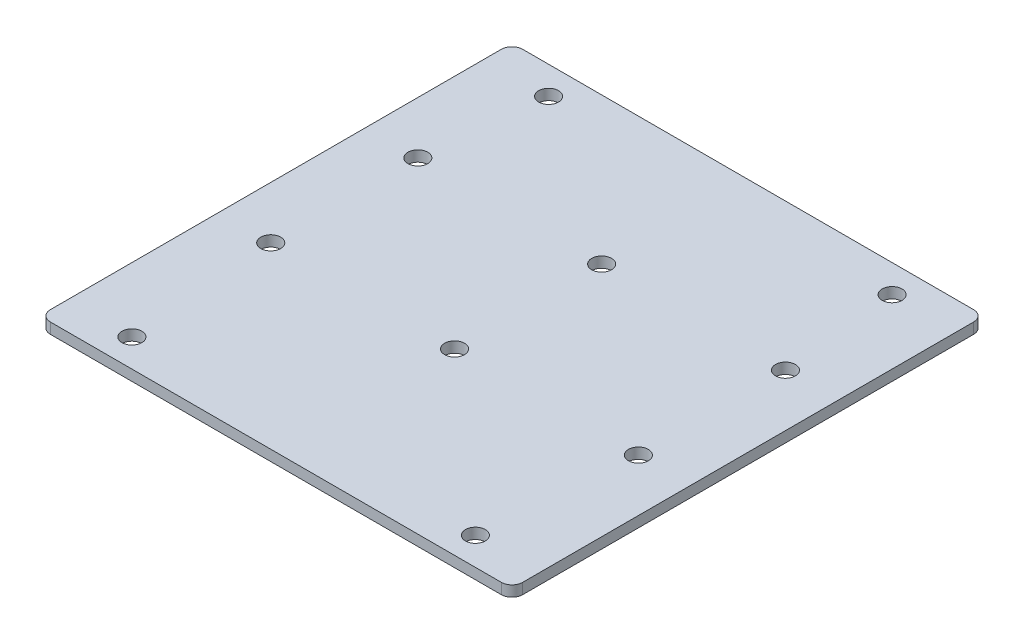
ISO-10303-21;
HEADER;
FILE_DESCRIPTION(('STEP AP214'),'2;1');
FILE_NAME('part.step','',(''),(''),'','','');
FILE_SCHEMA(('AUTOMOTIVE_DESIGN { 1 0 10303 214 1 1 1 1 }'));
ENDSEC;
DATA;
#1=APPLICATION_CONTEXT('core data for automotive mechanical design processes');
#2=APPLICATION_PROTOCOL_DEFINITION('international standard','automotive_design',2000,#1);
#3=PRODUCT_CONTEXT('',#1,'mechanical');
#4=PRODUCT('Part','Part','',(#3));
#5=PRODUCT_RELATED_PRODUCT_CATEGORY('part','',(#4));
#6=PRODUCT_DEFINITION_FORMATION('','',#4);
#7=PRODUCT_DEFINITION_CONTEXT('part definition',#1,'design');
#8=PRODUCT_DEFINITION('design','',#6,#7);
#9=PRODUCT_DEFINITION_SHAPE('','',#8);
#10=(LENGTH_UNIT() NAMED_UNIT(*) SI_UNIT(.MILLI.,.METRE.));
#11=(NAMED_UNIT(*) PLANE_ANGLE_UNIT() SI_UNIT($,.RADIAN.));
#12=(NAMED_UNIT(*) SI_UNIT($,.STERADIAN.) SOLID_ANGLE_UNIT());
#13=UNCERTAINTY_MEASURE_WITH_UNIT(LENGTH_MEASURE(1.E-05),#10,'distance_accuracy_value','');
#14=(GEOMETRIC_REPRESENTATION_CONTEXT(3) GLOBAL_UNCERTAINTY_ASSIGNED_CONTEXT((#13)) GLOBAL_UNIT_ASSIGNED_CONTEXT((#10,
#11,#12)) REPRESENTATION_CONTEXT('',''));
#15=CARTESIAN_POINT('',(0.,0.,0.));
#16=DIRECTION('',(0.,0.,1.));
#17=DIRECTION('',(1.,0.,0.));
#18=AXIS2_PLACEMENT_3D('',#15,#16,#17);
#19=CARTESIAN_POINT('',(-44.,2.,44.));
#20=DIRECTION('',(1.,0.,0.));
#21=DIRECTION('',(0.,0.,-1.));
#22=AXIS2_PLACEMENT_3D('',#19,#20,#21);
#23=PLANE('',#22);
#24=DIRECTION('',(0.,0.,1.));
#25=VECTOR('',#24,1.);
#26=CARTESIAN_POINT('',(-44.,2.,44.));
#27=LINE('',#26,#25);
#28=CARTESIAN_POINT('',(-44.,2.,-42.));
#29=VERTEX_POINT('',#28);
#30=CARTESIAN_POINT('',(-44.,2.,42.));
#31=VERTEX_POINT('',#30);
#32=EDGE_CURVE('E131',#29,#31,#27,.T.);
#33=ORIENTED_EDGE('',*,*,#32,.F.);
#34=DIRECTION('',(0.,-1.,0.));
#35=VECTOR('',#34,1.);
#36=CARTESIAN_POINT('',(-44.,2.,-42.));
#37=LINE('',#36,#35);
#38=CARTESIAN_POINT('',(-44.,0.,-42.));
#39=VERTEX_POINT('',#38);
#40=EDGE_CURVE('E115',#29,#39,#37,.T.);
#41=ORIENTED_EDGE('',*,*,#40,.T.);
#42=DIRECTION('',(0.,0.,1.));
#43=VECTOR('',#42,1.);
#44=CARTESIAN_POINT('',(-44.,0.,44.));
#45=LINE('',#44,#43);
#46=CARTESIAN_POINT('',(-44.,0.,42.));
#47=VERTEX_POINT('',#46);
#48=EDGE_CURVE('E128',#39,#47,#45,.T.);
#49=ORIENTED_EDGE('',*,*,#48,.T.);
#50=DIRECTION('',(0.,-1.,0.));
#51=VECTOR('',#50,1.);
#52=CARTESIAN_POINT('',(-44.,2.,42.));
#53=LINE('',#52,#51);
#54=EDGE_CURVE('E134',#47,#31,#53,.F.);
#55=ORIENTED_EDGE('',*,*,#54,.T.);
#56=EDGE_LOOP('',(#33,#41,#49,#55));
#57=FACE_BOUND('',#56,.T.);
#58=ADVANCED_FACE('F43',(#57),#23,.F.);
#59=CARTESIAN_POINT('',(44.,2.,44.));
#60=DIRECTION('',(0.,0.,-1.));
#61=DIRECTION('',(-1.,0.,0.));
#62=AXIS2_PLACEMENT_3D('',#59,#60,#61);
#63=PLANE('',#62);
#64=DIRECTION('',(1.,0.,0.));
#65=VECTOR('',#64,1.);
#66=CARTESIAN_POINT('',(44.,2.,44.));
#67=LINE('',#66,#65);
#68=CARTESIAN_POINT('',(-42.,2.,44.));
#69=VERTEX_POINT('',#68);
#70=CARTESIAN_POINT('',(42.,2.,44.));
#71=VERTEX_POINT('',#70);
#72=EDGE_CURVE('E194',#69,#71,#67,.T.);
#73=ORIENTED_EDGE('',*,*,#72,.F.);
#74=DIRECTION('',(0.,-1.,0.));
#75=VECTOR('',#74,1.);
#76=CARTESIAN_POINT('',(-42.,2.,44.));
#77=LINE('',#76,#75);
#78=CARTESIAN_POINT('',(-42.,0.,44.));
#79=VERTEX_POINT('',#78);
#80=EDGE_CURVE('E11',#69,#79,#77,.T.);
#81=ORIENTED_EDGE('',*,*,#80,.T.);
#82=DIRECTION('',(1.,0.,0.));
#83=VECTOR('',#82,1.);
#84=CARTESIAN_POINT('',(44.,0.,44.));
#85=LINE('',#84,#83);
#86=CARTESIAN_POINT('',(42.,0.,44.));
#87=VERTEX_POINT('',#86);
#88=EDGE_CURVE('E140',#79,#87,#85,.T.);
#89=ORIENTED_EDGE('',*,*,#88,.T.);
#90=DIRECTION('',(0.,-1.,0.));
#91=VECTOR('',#90,1.);
#92=CARTESIAN_POINT('',(42.,2.,44.));
#93=LINE('',#92,#91);
#94=EDGE_CURVE('E52',#87,#71,#93,.F.);
#95=ORIENTED_EDGE('',*,*,#94,.T.);
#96=EDGE_LOOP('',(#73,#81,#89,#95));
#97=FACE_BOUND('',#96,.T.);
#98=ADVANCED_FACE('F193',(#97),#63,.F.);
#99=CARTESIAN_POINT('',(44.,2.,44.));
#100=DIRECTION('',(-1.,0.,0.));
#101=DIRECTION('',(0.,0.,1.));
#102=AXIS2_PLACEMENT_3D('',#99,#100,#101);
#103=PLANE('',#102);
#104=DIRECTION('',(0.,0.,-1.));
#105=VECTOR('',#104,1.);
#106=CARTESIAN_POINT('',(44.,0.,44.));
#107=LINE('',#106,#105);
#108=CARTESIAN_POINT('',(44.,0.,42.));
#109=VERTEX_POINT('',#108);
#110=CARTESIAN_POINT('',(44.,0.,-42.));
#111=VERTEX_POINT('',#110);
#112=EDGE_CURVE('E146',#109,#111,#107,.T.);
#113=ORIENTED_EDGE('',*,*,#112,.T.);
#114=DIRECTION('',(0.,-1.,0.));
#115=VECTOR('',#114,1.);
#116=CARTESIAN_POINT('',(44.,2.,-42.));
#117=LINE('',#116,#115);
#118=CARTESIAN_POINT('',(44.,2.,-42.));
#119=VERTEX_POINT('',#118);
#120=EDGE_CURVE('E59',#111,#119,#117,.F.);
#121=ORIENTED_EDGE('',*,*,#120,.T.);
#122=DIRECTION('',(0.,0.,-1.));
#123=VECTOR('',#122,1.);
#124=CARTESIAN_POINT('',(44.,2.,44.));
#125=LINE('',#124,#123);
#126=CARTESIAN_POINT('',(44.,2.,42.));
#127=VERTEX_POINT('',#126);
#128=EDGE_CURVE('E201',#127,#119,#125,.T.);
#129=ORIENTED_EDGE('',*,*,#128,.F.);
#130=DIRECTION('',(0.,-1.,0.));
#131=VECTOR('',#130,1.);
#132=CARTESIAN_POINT('',(44.,2.,42.));
#133=LINE('',#132,#131);
#134=EDGE_CURVE('E184',#127,#109,#133,.T.);
#135=ORIENTED_EDGE('',*,*,#134,.T.);
#136=EDGE_LOOP('',(#113,#121,#129,#135));
#137=FACE_BOUND('',#136,.T.);
#138=ADVANCED_FACE('F205',(#137),#103,.F.);
#139=CARTESIAN_POINT('',(44.,2.,-44.));
#140=DIRECTION('',(0.,0.,1.));
#141=DIRECTION('',(1.,0.,0.));
#142=AXIS2_PLACEMENT_3D('',#139,#140,#141);
#143=PLANE('',#142);
#144=DIRECTION('',(-1.,0.,0.));
#145=VECTOR('',#144,1.);
#146=CARTESIAN_POINT('',(44.,0.,-44.));
#147=LINE('',#146,#145);
#148=CARTESIAN_POINT('',(42.,0.,-44.));
#149=VERTEX_POINT('',#148);
#150=CARTESIAN_POINT('',(-42.,0.,-44.));
#151=VERTEX_POINT('',#150);
#152=EDGE_CURVE('E157',#149,#151,#147,.T.);
#153=ORIENTED_EDGE('',*,*,#152,.T.);
#154=DIRECTION('',(0.,-1.,0.));
#155=VECTOR('',#154,1.);
#156=CARTESIAN_POINT('',(-42.,2.,-44.));
#157=LINE('',#156,#155);
#158=CARTESIAN_POINT('',(-42.,2.,-44.));
#159=VERTEX_POINT('',#158);
#160=EDGE_CURVE('E116',#151,#159,#157,.F.);
#161=ORIENTED_EDGE('',*,*,#160,.T.);
#162=DIRECTION('',(-1.,0.,0.));
#163=VECTOR('',#162,1.);
#164=CARTESIAN_POINT('',(44.,2.,-44.));
#165=LINE('',#164,#163);
#166=CARTESIAN_POINT('',(42.,2.,-44.));
#167=VERTEX_POINT('',#166);
#168=EDGE_CURVE('E152',#167,#159,#165,.T.);
#169=ORIENTED_EDGE('',*,*,#168,.F.);
#170=DIRECTION('',(0.,-1.,0.));
#171=VECTOR('',#170,1.);
#172=CARTESIAN_POINT('',(42.,2.,-44.));
#173=LINE('',#172,#171);
#174=EDGE_CURVE('E122',#167,#149,#173,.T.);
#175=ORIENTED_EDGE('',*,*,#174,.T.);
#176=EDGE_LOOP('',(#153,#161,#169,#175));
#177=FACE_BOUND('',#176,.T.);
#178=ADVANCED_FACE('F212',(#177),#143,.F.);
#179=CARTESIAN_POINT('',(0.,2.,0.));
#180=DIRECTION('',(0.,1.,0.));
#181=DIRECTION('',(0.,0.,1.));
#182=AXIS2_PLACEMENT_3D('',#179,#180,#181);
#183=PLANE('',#182);
#184=CARTESIAN_POINT('',(-34.2500000000001,2.,-16.7));
#185=DIRECTION('',(0.,1.,0.));
#186=DIRECTION('',(0.,0.,1.));
#187=AXIS2_PLACEMENT_3D('',#184,#185,#186);
#188=CIRCLE('',#187,1.85);
#189=CARTESIAN_POINT('',(-34.2500000000001,2.,-14.85));
#190=VERTEX_POINT('',#189);
#191=EDGE_CURVE('E239',#190,#190,#188,.T.);
#192=ORIENTED_EDGE('',*,*,#191,.F.);
#193=EDGE_LOOP('',(#192));
#194=FACE_BOUND('',#193,.T.);
#195=CARTESIAN_POINT('',(0.,2.,-16.7));
#196=DIRECTION('',(0.,1.,0.));
#197=DIRECTION('',(0.,0.,1.));
#198=AXIS2_PLACEMENT_3D('',#195,#196,#197);
#199=CIRCLE('',#198,1.85);
#200=CARTESIAN_POINT('',(0.,2.,-14.85));
#201=VERTEX_POINT('',#200);
#202=EDGE_CURVE('E249',#201,#201,#199,.T.);
#203=ORIENTED_EDGE('',*,*,#202,.F.);
#204=EDGE_LOOP('',(#203));
#205=FACE_BOUND('',#204,.T.);
#206=CARTESIAN_POINT('',(34.2499999999998,2.,-16.7));
#207=DIRECTION('',(0.,1.,0.));
#208=DIRECTION('',(0.,0.,1.));
#209=AXIS2_PLACEMENT_3D('',#206,#207,#208);
#210=CIRCLE('',#209,1.85);
#211=CARTESIAN_POINT('',(34.2499999999998,2.,-14.85));
#212=VERTEX_POINT('',#211);
#213=EDGE_CURVE('E253',#212,#212,#210,.T.);
#214=ORIENTED_EDGE('',*,*,#213,.F.);
#215=EDGE_LOOP('',(#214));
#216=FACE_BOUND('',#215,.T.);
#217=CARTESIAN_POINT('',(34.2499999999999,2.,10.7));
#218=DIRECTION('',(0.,1.,0.));
#219=DIRECTION('',(0.,0.,1.));
#220=AXIS2_PLACEMENT_3D('',#217,#218,#219);
#221=CIRCLE('',#220,1.85);
#222=CARTESIAN_POINT('',(34.2499999999999,2.,12.55));
#223=VERTEX_POINT('',#222);
#224=EDGE_CURVE('E257',#223,#223,#221,.T.);
#225=ORIENTED_EDGE('',*,*,#224,.F.);
#226=EDGE_LOOP('',(#225));
#227=FACE_BOUND('',#226,.T.);
#228=CARTESIAN_POINT('',(-1.01827385961168E-13,2.,10.7));
#229=DIRECTION('',(0.,1.,0.));
#230=DIRECTION('',(0.,0.,1.));
#231=AXIS2_PLACEMENT_3D('',#228,#229,#230);
#232=CIRCLE('',#231,1.85);
#233=CARTESIAN_POINT('',(-1.01827385961168E-13,2.,12.55));
#234=VERTEX_POINT('',#233);
#235=EDGE_CURVE('E261',#234,#234,#232,.T.);
#236=ORIENTED_EDGE('',*,*,#235,.F.);
#237=EDGE_LOOP('',(#236));
#238=FACE_BOUND('',#237,.T.);
#239=CARTESIAN_POINT('',(-34.2500000000001,2.,10.7));
#240=DIRECTION('',(0.,1.,0.));
#241=DIRECTION('',(0.,0.,1.));
#242=AXIS2_PLACEMENT_3D('',#239,#240,#241);
#243=CIRCLE('',#242,1.85);
#244=CARTESIAN_POINT('',(-34.2500000000001,2.,12.55));
#245=VERTEX_POINT('',#244);
#246=EDGE_CURVE('E265',#245,#245,#243,.T.);
#247=ORIENTED_EDGE('',*,*,#246,.F.);
#248=EDGE_LOOP('',(#247));
#249=FACE_BOUND('',#248,.T.);
#250=CARTESIAN_POINT('',(-32.,2.,-38.82));
#251=DIRECTION('',(0.,1.,0.));
#252=DIRECTION('',(0.,0.,1.));
#253=AXIS2_PLACEMENT_3D('',#250,#251,#252);
#254=CIRCLE('',#253,1.85);
#255=CARTESIAN_POINT('',(-32.,2.,-36.97));
#256=VERTEX_POINT('',#255);
#257=EDGE_CURVE('E141',#256,#256,#254,.T.);
#258=ORIENTED_EDGE('',*,*,#257,.F.);
#259=EDGE_LOOP('',(#258));
#260=FACE_BOUND('',#259,.T.);
#261=CARTESIAN_POINT('',(32.,2.,-38.82));
#262=DIRECTION('',(0.,1.,0.));
#263=DIRECTION('',(0.,0.,1.));
#264=AXIS2_PLACEMENT_3D('',#261,#262,#263);
#265=CIRCLE('',#264,1.85);
#266=CARTESIAN_POINT('',(32.,2.,-36.97));
#267=VERTEX_POINT('',#266);
#268=EDGE_CURVE('E149',#267,#267,#265,.T.);
#269=ORIENTED_EDGE('',*,*,#268,.F.);
#270=EDGE_LOOP('',(#269));
#271=FACE_BOUND('',#270,.T.);
#272=CARTESIAN_POINT('',(31.9999999999999,2.,38.82));
#273=DIRECTION('',(0.,1.,0.));
#274=DIRECTION('',(0.,0.,1.));
#275=AXIS2_PLACEMENT_3D('',#272,#273,#274);
#276=CIRCLE('',#275,1.85);
#277=CARTESIAN_POINT('',(31.9999999999999,2.,40.67));
#278=VERTEX_POINT('',#277);
#279=EDGE_CURVE('E221',#278,#278,#276,.T.);
#280=ORIENTED_EDGE('',*,*,#279,.F.);
#281=EDGE_LOOP('',(#280));
#282=FACE_BOUND('',#281,.T.);
#283=CARTESIAN_POINT('',(-32.0000000000001,2.,38.82));
#284=DIRECTION('',(0.,1.,0.));
#285=DIRECTION('',(0.,0.,1.));
#286=AXIS2_PLACEMENT_3D('',#283,#284,#285);
#287=CIRCLE('',#286,1.85);
#288=CARTESIAN_POINT('',(-32.0000000000001,2.,40.67));
#289=VERTEX_POINT('',#288);
#290=EDGE_CURVE('E225',#289,#289,#287,.T.);
#291=ORIENTED_EDGE('',*,*,#290,.F.);
#292=EDGE_LOOP('',(#291));
#293=FACE_BOUND('',#292,.T.);
#294=ORIENTED_EDGE('',*,*,#168,.T.);
#295=CARTESIAN_POINT('',(-42.,2.,-42.));
#296=DIRECTION('',(0.,1.,0.));
#297=DIRECTION('',(0.,0.,1.));
#298=AXIS2_PLACEMENT_3D('',#295,#296,#297);
#299=CIRCLE('',#298,2.);
#300=EDGE_CURVE('E181',#159,#29,#299,.T.);
#301=ORIENTED_EDGE('',*,*,#300,.T.);
#302=ORIENTED_EDGE('',*,*,#32,.T.);
#303=CARTESIAN_POINT('',(-42.,2.,42.));
#304=DIRECTION('',(0.,1.,0.));
#305=DIRECTION('',(0.,0.,1.));
#306=AXIS2_PLACEMENT_3D('',#303,#304,#305);
#307=CIRCLE('',#306,2.);
#308=EDGE_CURVE('E175',#31,#69,#307,.T.);
#309=ORIENTED_EDGE('',*,*,#308,.T.);
#310=ORIENTED_EDGE('',*,*,#72,.T.);
#311=CARTESIAN_POINT('',(42.,2.,42.));
#312=DIRECTION('',(0.,1.,0.));
#313=DIRECTION('',(0.,0.,1.));
#314=AXIS2_PLACEMENT_3D('',#311,#312,#313);
#315=CIRCLE('',#314,2.);
#316=EDGE_CURVE('E66',#71,#127,#315,.T.);
#317=ORIENTED_EDGE('',*,*,#316,.T.);
#318=ORIENTED_EDGE('',*,*,#128,.T.);
#319=CARTESIAN_POINT('',(42.,2.,-42.));
#320=DIRECTION('',(0.,1.,0.));
#321=DIRECTION('',(0.,0.,1.));
#322=AXIS2_PLACEMENT_3D('',#319,#320,#321);
#323=CIRCLE('',#322,2.);
#324=EDGE_CURVE('E178',#119,#167,#323,.T.);
#325=ORIENTED_EDGE('',*,*,#324,.T.);
#326=EDGE_LOOP('',(#294,#301,#302,#309,#310,#317,#318,#325));
#327=FACE_BOUND('',#326,.T.);
#328=ADVANCED_FACE('F198',(#194,#205,#216,#227,#238,#249,#260,#271,#282,#293,#327),#183,.T.);
#329=CARTESIAN_POINT('',(0.,0.,0.));
#330=DIRECTION('',(0.,1.,0.));
#331=DIRECTION('',(0.,0.,1.));
#332=AXIS2_PLACEMENT_3D('',#329,#330,#331);
#333=PLANE('',#332);
#334=CARTESIAN_POINT('',(-34.2500000000001,0.,-16.7));
#335=DIRECTION('',(0.,-1.,0.));
#336=DIRECTION('',(0.,0.,-1.));
#337=AXIS2_PLACEMENT_3D('',#334,#335,#336);
#338=CIRCLE('',#337,1.85);
#339=CARTESIAN_POINT('',(-34.2500000000001,0.,-18.55));
#340=VERTEX_POINT('',#339);
#341=EDGE_CURVE('E274',#340,#340,#338,.T.);
#342=ORIENTED_EDGE('',*,*,#341,.F.);
#343=EDGE_LOOP('',(#342));
#344=FACE_BOUND('',#343,.T.);
#345=CARTESIAN_POINT('',(0.,0.,-16.7));
#346=DIRECTION('',(0.,-1.,0.));
#347=DIRECTION('',(0.,0.,-1.));
#348=AXIS2_PLACEMENT_3D('',#345,#346,#347);
#349=CIRCLE('',#348,1.85);
#350=CARTESIAN_POINT('',(0.,0.,-18.55));
#351=VERTEX_POINT('',#350);
#352=EDGE_CURVE('E278',#351,#351,#349,.T.);
#353=ORIENTED_EDGE('',*,*,#352,.F.);
#354=EDGE_LOOP('',(#353));
#355=FACE_BOUND('',#354,.T.);
#356=CARTESIAN_POINT('',(34.2499999999998,0.,-16.7));
#357=DIRECTION('',(0.,-1.,0.));
#358=DIRECTION('',(0.,0.,-1.));
#359=AXIS2_PLACEMENT_3D('',#356,#357,#358);
#360=CIRCLE('',#359,1.85);
#361=CARTESIAN_POINT('',(34.2499999999998,0.,-18.55));
#362=VERTEX_POINT('',#361);
#363=EDGE_CURVE('E282',#362,#362,#360,.T.);
#364=ORIENTED_EDGE('',*,*,#363,.F.);
#365=EDGE_LOOP('',(#364));
#366=FACE_BOUND('',#365,.T.);
#367=CARTESIAN_POINT('',(34.2499999999999,0.,10.7));
#368=DIRECTION('',(0.,-1.,0.));
#369=DIRECTION('',(0.,0.,-1.));
#370=AXIS2_PLACEMENT_3D('',#367,#368,#369);
#371=CIRCLE('',#370,1.85);
#372=CARTESIAN_POINT('',(34.2499999999999,0.,8.85000000000002));
#373=VERTEX_POINT('',#372);
#374=EDGE_CURVE('E286',#373,#373,#371,.T.);
#375=ORIENTED_EDGE('',*,*,#374,.F.);
#376=EDGE_LOOP('',(#375));
#377=FACE_BOUND('',#376,.T.);
#378=CARTESIAN_POINT('',(-1.01827385961168E-13,0.,10.7));
#379=DIRECTION('',(0.,-1.,0.));
#380=DIRECTION('',(0.,0.,-1.));
#381=AXIS2_PLACEMENT_3D('',#378,#379,#380);
#382=CIRCLE('',#381,1.85);
#383=CARTESIAN_POINT('',(-1.01827385961168E-13,0.,8.85000000000004));
#384=VERTEX_POINT('',#383);
#385=EDGE_CURVE('E273',#384,#384,#382,.T.);
#386=ORIENTED_EDGE('',*,*,#385,.F.);
#387=EDGE_LOOP('',(#386));
#388=FACE_BOUND('',#387,.T.);
#389=CARTESIAN_POINT('',(-34.2500000000001,0.,10.7));
#390=DIRECTION('',(0.,-1.,0.));
#391=DIRECTION('',(0.,0.,-1.));
#392=AXIS2_PLACEMENT_3D('',#389,#390,#391);
#393=CIRCLE('',#392,1.85);
#394=CARTESIAN_POINT('',(-34.2500000000001,0.,8.85000000000001));
#395=VERTEX_POINT('',#394);
#396=EDGE_CURVE('E269',#395,#395,#393,.T.);
#397=ORIENTED_EDGE('',*,*,#396,.F.);
#398=EDGE_LOOP('',(#397));
#399=FACE_BOUND('',#398,.T.);
#400=CARTESIAN_POINT('',(-32.,0.,-38.82));
#401=DIRECTION('',(0.,-1.,0.));
#402=DIRECTION('',(0.,0.,-1.));
#403=AXIS2_PLACEMENT_3D('',#400,#401,#402);
#404=CIRCLE('',#403,1.85);
#405=CARTESIAN_POINT('',(-32.,0.,-40.67));
#406=VERTEX_POINT('',#405);
#407=EDGE_CURVE('E234',#406,#406,#404,.T.);
#408=ORIENTED_EDGE('',*,*,#407,.F.);
#409=EDGE_LOOP('',(#408));
#410=FACE_BOUND('',#409,.T.);
#411=CARTESIAN_POINT('',(32.,0.,-38.82));
#412=DIRECTION('',(0.,-1.,0.));
#413=DIRECTION('',(0.,0.,-1.));
#414=AXIS2_PLACEMENT_3D('',#411,#412,#413);
#415=CIRCLE('',#414,1.85);
#416=CARTESIAN_POINT('',(32.,0.,-40.67));
#417=VERTEX_POINT('',#416);
#418=EDGE_CURVE('E238',#417,#417,#415,.T.);
#419=ORIENTED_EDGE('',*,*,#418,.F.);
#420=EDGE_LOOP('',(#419));
#421=FACE_BOUND('',#420,.T.);
#422=CARTESIAN_POINT('',(31.9999999999999,0.,38.82));
#423=DIRECTION('',(0.,-1.,0.));
#424=DIRECTION('',(0.,0.,-1.));
#425=AXIS2_PLACEMENT_3D('',#422,#423,#424);
#426=CIRCLE('',#425,1.85);
#427=CARTESIAN_POINT('',(31.9999999999999,0.,36.97));
#428=VERTEX_POINT('',#427);
#429=EDGE_CURVE('E233',#428,#428,#426,.T.);
#430=ORIENTED_EDGE('',*,*,#429,.F.);
#431=EDGE_LOOP('',(#430));
#432=FACE_BOUND('',#431,.T.);
#433=CARTESIAN_POINT('',(-32.0000000000001,0.,38.82));
#434=DIRECTION('',(0.,-1.,0.));
#435=DIRECTION('',(0.,0.,-1.));
#436=AXIS2_PLACEMENT_3D('',#433,#434,#435);
#437=CIRCLE('',#436,1.85);
#438=CARTESIAN_POINT('',(-32.0000000000001,0.,36.97));
#439=VERTEX_POINT('',#438);
#440=EDGE_CURVE('E229',#439,#439,#437,.T.);
#441=ORIENTED_EDGE('',*,*,#440,.F.);
#442=EDGE_LOOP('',(#441));
#443=FACE_BOUND('',#442,.T.);
#444=ORIENTED_EDGE('',*,*,#48,.F.);
#445=CARTESIAN_POINT('',(-42.,0.,-42.));
#446=DIRECTION('',(0.,1.,0.));
#447=DIRECTION('',(0.,0.,1.));
#448=AXIS2_PLACEMENT_3D('',#445,#446,#447);
#449=CIRCLE('',#448,2.);
#450=EDGE_CURVE('E111',#39,#151,#449,.F.);
#451=ORIENTED_EDGE('',*,*,#450,.T.);
#452=ORIENTED_EDGE('',*,*,#152,.F.);
#453=CARTESIAN_POINT('',(42.,0.,-42.));
#454=DIRECTION('',(0.,1.,0.));
#455=DIRECTION('',(0.,0.,1.));
#456=AXIS2_PLACEMENT_3D('',#453,#454,#455);
#457=CIRCLE('',#456,2.);
#458=EDGE_CURVE('E123',#149,#111,#457,.F.);
#459=ORIENTED_EDGE('',*,*,#458,.T.);
#460=ORIENTED_EDGE('',*,*,#112,.F.);
#461=CARTESIAN_POINT('',(42.,0.,42.));
#462=DIRECTION('',(0.,1.,0.));
#463=DIRECTION('',(0.,0.,1.));
#464=AXIS2_PLACEMENT_3D('',#461,#462,#463);
#465=CIRCLE('',#464,2.);
#466=EDGE_CURVE('E133',#109,#87,#465,.F.);
#467=ORIENTED_EDGE('',*,*,#466,.T.);
#468=ORIENTED_EDGE('',*,*,#88,.F.);
#469=CARTESIAN_POINT('',(-42.,0.,42.));
#470=DIRECTION('',(0.,1.,0.));
#471=DIRECTION('',(0.,0.,1.));
#472=AXIS2_PLACEMENT_3D('',#469,#470,#471);
#473=CIRCLE('',#472,2.);
#474=EDGE_CURVE('E138',#79,#47,#473,.F.);
#475=ORIENTED_EDGE('',*,*,#474,.T.);
#476=EDGE_LOOP('',(#444,#451,#452,#459,#460,#467,#468,#475));
#477=FACE_BOUND('',#476,.T.);
#478=ADVANCED_FACE('F136',(#344,#355,#366,#377,#388,#399,#410,#421,#432,#443,#477),#333,.F.);
#479=CARTESIAN_POINT('',(-42.,2.,-42.));
#480=DIRECTION('',(0.,-1.,0.));
#481=DIRECTION('',(0.,0.,-1.));
#482=AXIS2_PLACEMENT_3D('',#479,#480,#481);
#483=CYLINDRICAL_SURFACE('',#482,2.);
#484=ORIENTED_EDGE('',*,*,#300,.F.);
#485=ORIENTED_EDGE('',*,*,#160,.F.);
#486=ORIENTED_EDGE('',*,*,#450,.F.);
#487=ORIENTED_EDGE('',*,*,#40,.F.);
#488=EDGE_LOOP('',(#484,#485,#486,#487));
#489=FACE_BOUND('',#488,.T.);
#490=ADVANCED_FACE('F114',(#489),#483,.T.);
#491=CARTESIAN_POINT('',(42.,2.,-42.));
#492=DIRECTION('',(0.,-1.,0.));
#493=DIRECTION('',(0.,0.,-1.));
#494=AXIS2_PLACEMENT_3D('',#491,#492,#493);
#495=CYLINDRICAL_SURFACE('',#494,2.);
#496=ORIENTED_EDGE('',*,*,#324,.F.);
#497=ORIENTED_EDGE('',*,*,#120,.F.);
#498=ORIENTED_EDGE('',*,*,#458,.F.);
#499=ORIENTED_EDGE('',*,*,#174,.F.);
#500=EDGE_LOOP('',(#496,#497,#498,#499));
#501=FACE_BOUND('',#500,.T.);
#502=ADVANCED_FACE('F209',(#501),#495,.T.);
#503=CARTESIAN_POINT('',(-42.,2.,42.));
#504=DIRECTION('',(0.,-1.,0.));
#505=DIRECTION('',(0.,0.,-1.));
#506=AXIS2_PLACEMENT_3D('',#503,#504,#505);
#507=CYLINDRICAL_SURFACE('',#506,2.);
#508=ORIENTED_EDGE('',*,*,#308,.F.);
#509=ORIENTED_EDGE('',*,*,#54,.F.);
#510=ORIENTED_EDGE('',*,*,#474,.F.);
#511=ORIENTED_EDGE('',*,*,#80,.F.);
#512=EDGE_LOOP('',(#508,#509,#510,#511));
#513=FACE_BOUND('',#512,.T.);
#514=ADVANCED_FACE('F322',(#513),#507,.T.);
#515=CARTESIAN_POINT('',(42.,2.,42.));
#516=DIRECTION('',(0.,-1.,0.));
#517=DIRECTION('',(0.,0.,-1.));
#518=AXIS2_PLACEMENT_3D('',#515,#516,#517);
#519=CYLINDRICAL_SURFACE('',#518,2.);
#520=ORIENTED_EDGE('',*,*,#316,.F.);
#521=ORIENTED_EDGE('',*,*,#94,.F.);
#522=ORIENTED_EDGE('',*,*,#466,.F.);
#523=ORIENTED_EDGE('',*,*,#134,.F.);
#524=EDGE_LOOP('',(#520,#521,#522,#523));
#525=FACE_BOUND('',#524,.T.);
#526=ADVANCED_FACE('F45',(#525),#519,.T.);
#527=CARTESIAN_POINT('',(-32.0000000000001,10.,38.82));
#528=DIRECTION('',(0.,-1.,0.));
#529=DIRECTION('',(0.,0.,-1.));
#530=AXIS2_PLACEMENT_3D('',#527,#528,#529);
#531=CYLINDRICAL_SURFACE('',#530,1.85);
#532=ORIENTED_EDGE('',*,*,#290,.T.);
#533=EDGE_LOOP('',(#532));
#534=FACE_BOUND('',#533,.T.);
#535=ORIENTED_EDGE('',*,*,#440,.T.);
#536=EDGE_LOOP('',(#535));
#537=FACE_BOUND('',#536,.T.);
#538=ADVANCED_FACE('F310',(#534,#537),#531,.F.);
#539=CARTESIAN_POINT('',(31.9999999999999,10.,38.82));
#540=DIRECTION('',(0.,-1.,0.));
#541=DIRECTION('',(0.,0.,-1.));
#542=AXIS2_PLACEMENT_3D('',#539,#540,#541);
#543=CYLINDRICAL_SURFACE('',#542,1.85);
#544=ORIENTED_EDGE('',*,*,#279,.T.);
#545=EDGE_LOOP('',(#544));
#546=FACE_BOUND('',#545,.T.);
#547=ORIENTED_EDGE('',*,*,#429,.T.);
#548=EDGE_LOOP('',(#547));
#549=FACE_BOUND('',#548,.T.);
#550=ADVANCED_FACE('F312',(#546,#549),#543,.F.);
#551=CARTESIAN_POINT('',(32.,10.,-38.82));
#552=DIRECTION('',(0.,-1.,0.));
#553=DIRECTION('',(0.,0.,-1.));
#554=AXIS2_PLACEMENT_3D('',#551,#552,#553);
#555=CYLINDRICAL_SURFACE('',#554,1.85);
#556=ORIENTED_EDGE('',*,*,#268,.T.);
#557=EDGE_LOOP('',(#556));
#558=FACE_BOUND('',#557,.T.);
#559=ORIENTED_EDGE('',*,*,#418,.T.);
#560=EDGE_LOOP('',(#559));
#561=FACE_BOUND('',#560,.T.);
#562=ADVANCED_FACE('F319',(#558,#561),#555,.F.);
#563=CARTESIAN_POINT('',(-32.,10.,-38.82));
#564=DIRECTION('',(0.,-1.,0.));
#565=DIRECTION('',(0.,0.,-1.));
#566=AXIS2_PLACEMENT_3D('',#563,#564,#565);
#567=CYLINDRICAL_SURFACE('',#566,1.85);
#568=ORIENTED_EDGE('',*,*,#257,.T.);
#569=EDGE_LOOP('',(#568));
#570=FACE_BOUND('',#569,.T.);
#571=ORIENTED_EDGE('',*,*,#407,.T.);
#572=EDGE_LOOP('',(#571));
#573=FACE_BOUND('',#572,.T.);
#574=ADVANCED_FACE('F368',(#570,#573),#567,.F.);
#575=CARTESIAN_POINT('',(-34.2500000000001,5.,10.7));
#576=DIRECTION('',(0.,-1.,0.));
#577=DIRECTION('',(0.,0.,-1.));
#578=AXIS2_PLACEMENT_3D('',#575,#576,#577);
#579=CYLINDRICAL_SURFACE('',#578,1.85);
#580=ORIENTED_EDGE('',*,*,#246,.T.);
#581=EDGE_LOOP('',(#580));
#582=FACE_BOUND('',#581,.T.);
#583=ORIENTED_EDGE('',*,*,#396,.T.);
#584=EDGE_LOOP('',(#583));
#585=FACE_BOUND('',#584,.T.);
#586=ADVANCED_FACE('F379',(#582,#585),#579,.F.);
#587=CARTESIAN_POINT('',(-1.01827385961168E-13,5.,10.7));
#588=DIRECTION('',(0.,-1.,0.));
#589=DIRECTION('',(0.,0.,-1.));
#590=AXIS2_PLACEMENT_3D('',#587,#588,#589);
#591=CYLINDRICAL_SURFACE('',#590,1.85);
#592=ORIENTED_EDGE('',*,*,#235,.T.);
#593=EDGE_LOOP('',(#592));
#594=FACE_BOUND('',#593,.T.);
#595=ORIENTED_EDGE('',*,*,#385,.T.);
#596=EDGE_LOOP('',(#595));
#597=FACE_BOUND('',#596,.T.);
#598=ADVANCED_FACE('F294',(#594,#597),#591,.F.);
#599=CARTESIAN_POINT('',(34.2499999999999,5.,10.7));
#600=DIRECTION('',(0.,-1.,0.));
#601=DIRECTION('',(0.,0.,-1.));
#602=AXIS2_PLACEMENT_3D('',#599,#600,#601);
#603=CYLINDRICAL_SURFACE('',#602,1.85);
#604=ORIENTED_EDGE('',*,*,#224,.T.);
#605=EDGE_LOOP('',(#604));
#606=FACE_BOUND('',#605,.T.);
#607=ORIENTED_EDGE('',*,*,#374,.T.);
#608=EDGE_LOOP('',(#607));
#609=FACE_BOUND('',#608,.T.);
#610=ADVANCED_FACE('F418',(#606,#609),#603,.F.);
#611=CARTESIAN_POINT('',(34.2499999999998,5.,-16.7));
#612=DIRECTION('',(0.,-1.,0.));
#613=DIRECTION('',(0.,0.,-1.));
#614=AXIS2_PLACEMENT_3D('',#611,#612,#613);
#615=CYLINDRICAL_SURFACE('',#614,1.85);
#616=ORIENTED_EDGE('',*,*,#213,.T.);
#617=EDGE_LOOP('',(#616));
#618=FACE_BOUND('',#617,.T.);
#619=ORIENTED_EDGE('',*,*,#363,.T.);
#620=EDGE_LOOP('',(#619));
#621=FACE_BOUND('',#620,.T.);
#622=ADVANCED_FACE('F429',(#618,#621),#615,.F.);
#623=CARTESIAN_POINT('',(0.,5.,-16.7));
#624=DIRECTION('',(0.,-1.,0.));
#625=DIRECTION('',(0.,0.,-1.));
#626=AXIS2_PLACEMENT_3D('',#623,#624,#625);
#627=CYLINDRICAL_SURFACE('',#626,1.85);
#628=ORIENTED_EDGE('',*,*,#202,.T.);
#629=EDGE_LOOP('',(#628));
#630=FACE_BOUND('',#629,.T.);
#631=ORIENTED_EDGE('',*,*,#352,.T.);
#632=EDGE_LOOP('',(#631));
#633=FACE_BOUND('',#632,.T.);
#634=ADVANCED_FACE('F440',(#630,#633),#627,.F.);
#635=CARTESIAN_POINT('',(-34.2500000000001,5.,-16.7));
#636=DIRECTION('',(0.,-1.,0.));
#637=DIRECTION('',(0.,0.,-1.));
#638=AXIS2_PLACEMENT_3D('',#635,#636,#637);
#639=CYLINDRICAL_SURFACE('',#638,1.85);
#640=ORIENTED_EDGE('',*,*,#191,.T.);
#641=EDGE_LOOP('',(#640));
#642=FACE_BOUND('',#641,.T.);
#643=ORIENTED_EDGE('',*,*,#341,.T.);
#644=EDGE_LOOP('',(#643));
#645=FACE_BOUND('',#644,.T.);
#646=ADVANCED_FACE('F451',(#642,#645),#639,.F.);
#647=CLOSED_SHELL('',(#58,#98,#138,#178,#328,#478,#490,#502,#514,#526,#538,#550,#562,#574,#586,
#598,#610,#622,#634,#646));
#648=MANIFOLD_SOLID_BREP('B2',#647);
#649=ADVANCED_BREP_SHAPE_REPRESENTATION('',(#18,#648),#14);
#650=SHAPE_DEFINITION_REPRESENTATION(#9,#649);
ENDSEC;
END-ISO-10303-21;
